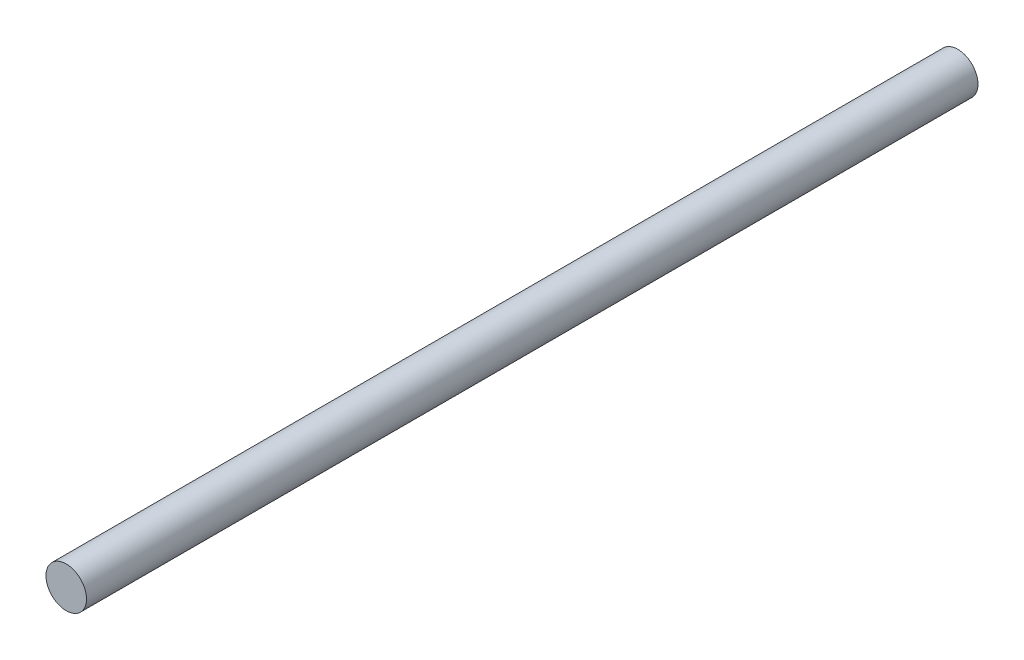
ISO-10303-21;
HEADER;
FILE_DESCRIPTION(('STEP AP214'),'2;1');
FILE_NAME('part.step','',(''),(''),'','','');
FILE_SCHEMA(('AUTOMOTIVE_DESIGN { 1 0 10303 214 1 1 1 1 }'));
ENDSEC;
DATA;
#1=APPLICATION_CONTEXT('core data for automotive mechanical design processes');
#2=APPLICATION_PROTOCOL_DEFINITION('international standard','automotive_design',2000,#1);
#3=PRODUCT_CONTEXT('',#1,'mechanical');
#4=PRODUCT('Part','Part','',(#3));
#5=PRODUCT_RELATED_PRODUCT_CATEGORY('part','',(#4));
#6=PRODUCT_DEFINITION_FORMATION('','',#4);
#7=PRODUCT_DEFINITION_CONTEXT('part definition',#1,'design');
#8=PRODUCT_DEFINITION('design','',#6,#7);
#9=PRODUCT_DEFINITION_SHAPE('','',#8);
#10=(LENGTH_UNIT() NAMED_UNIT(*) SI_UNIT(.MILLI.,.METRE.));
#11=(NAMED_UNIT(*) PLANE_ANGLE_UNIT() SI_UNIT($,.RADIAN.));
#12=(NAMED_UNIT(*) SI_UNIT($,.STERADIAN.) SOLID_ANGLE_UNIT());
#13=UNCERTAINTY_MEASURE_WITH_UNIT(LENGTH_MEASURE(1.E-05),#10,'distance_accuracy_value','');
#14=(GEOMETRIC_REPRESENTATION_CONTEXT(3) GLOBAL_UNCERTAINTY_ASSIGNED_CONTEXT((#13)) GLOBAL_UNIT_ASSIGNED_CONTEXT((#10,
#11,#12)) REPRESENTATION_CONTEXT('',''));
#15=CARTESIAN_POINT('',(0.,0.,0.));
#16=DIRECTION('',(0.,0.,1.));
#17=DIRECTION('',(1.,0.,0.));
#18=AXIS2_PLACEMENT_3D('',#15,#16,#17);
#19=CARTESIAN_POINT('',(0.,0.,279.4));
#20=DIRECTION('',(0.,0.,-1.));
#21=DIRECTION('',(-1.,0.,0.));
#22=AXIS2_PLACEMENT_3D('',#19,#20,#21);
#23=CYLINDRICAL_SURFACE('',#22,6.35);
#24=CARTESIAN_POINT('',(0.,0.,279.4));
#25=DIRECTION('',(0.,0.,1.));
#26=DIRECTION('',(1.,0.,0.));
#27=AXIS2_PLACEMENT_3D('',#24,#25,#26);
#28=CIRCLE('',#27,6.35);
#29=CARTESIAN_POINT('',(6.35,0.,279.4));
#30=VERTEX_POINT('',#29);
#31=EDGE_CURVE('E10',#30,#30,#28,.T.);
#32=ORIENTED_EDGE('',*,*,#31,.F.);
#33=EDGE_LOOP('',(#32));
#34=FACE_BOUND('',#33,.T.);
#35=CARTESIAN_POINT('',(0.,0.,0.));
#36=DIRECTION('',(0.,0.,1.));
#37=DIRECTION('',(1.,0.,0.));
#38=AXIS2_PLACEMENT_3D('',#35,#36,#37);
#39=CIRCLE('',#38,6.35);
#40=CARTESIAN_POINT('',(6.35,0.,0.));
#41=VERTEX_POINT('',#40);
#42=EDGE_CURVE('E34',#41,#41,#39,.T.);
#43=ORIENTED_EDGE('',*,*,#42,.T.);
#44=EDGE_LOOP('',(#43));
#45=FACE_BOUND('',#44,.T.);
#46=ADVANCED_FACE('F31',(#34,#45),#23,.T.);
#47=CARTESIAN_POINT('',(0.,0.,279.4));
#48=DIRECTION('',(0.,0.,1.));
#49=DIRECTION('',(1.,0.,0.));
#50=AXIS2_PLACEMENT_3D('',#47,#48,#49);
#51=PLANE('',#50);
#52=ORIENTED_EDGE('',*,*,#31,.T.);
#53=EDGE_LOOP('',(#52));
#54=FACE_BOUND('',#53,.T.);
#55=ADVANCED_FACE('F46',(#54),#51,.T.);
#56=CARTESIAN_POINT('',(0.,0.,0.));
#57=DIRECTION('',(0.,0.,1.));
#58=DIRECTION('',(1.,0.,0.));
#59=AXIS2_PLACEMENT_3D('',#56,#57,#58);
#60=PLANE('',#59);
#61=ORIENTED_EDGE('',*,*,#42,.F.);
#62=EDGE_LOOP('',(#61));
#63=FACE_BOUND('',#62,.T.);
#64=ADVANCED_FACE('F44',(#63),#60,.F.);
#65=CLOSED_SHELL('',(#46,#55,#64));
#66=MANIFOLD_SOLID_BREP('B2',#65);
#67=ADVANCED_BREP_SHAPE_REPRESENTATION('',(#18,#66),#14);
#68=SHAPE_DEFINITION_REPRESENTATION(#9,#67);
ENDSEC;
END-ISO-10303-21;
